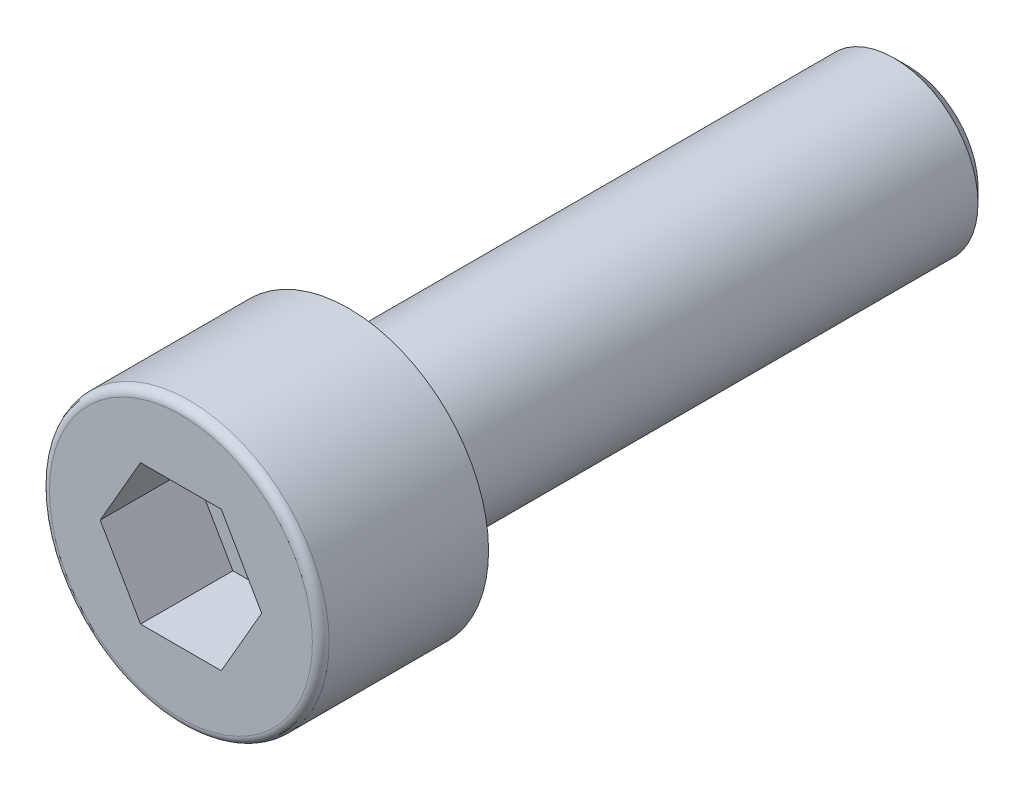
ISO-10303-21;
HEADER;
FILE_DESCRIPTION(('STEP AP214'),'2;1');
FILE_NAME('part.step','',(''),(''),'','','');
FILE_SCHEMA(('AUTOMOTIVE_DESIGN { 1 0 10303 214 1 1 1 1 }'));
ENDSEC;
DATA;
#1=APPLICATION_CONTEXT('core data for automotive mechanical design processes');
#2=APPLICATION_PROTOCOL_DEFINITION('international standard','automotive_design',2000,#1);
#3=PRODUCT_CONTEXT('',#1,'mechanical');
#4=PRODUCT('Part','Part','',(#3));
#5=PRODUCT_RELATED_PRODUCT_CATEGORY('part','',(#4));
#6=PRODUCT_DEFINITION_FORMATION('','',#4);
#7=PRODUCT_DEFINITION_CONTEXT('part definition',#1,'design');
#8=PRODUCT_DEFINITION('design','',#6,#7);
#9=PRODUCT_DEFINITION_SHAPE('','',#8);
#10=(LENGTH_UNIT() NAMED_UNIT(*) SI_UNIT(.MILLI.,.METRE.));
#11=(NAMED_UNIT(*) PLANE_ANGLE_UNIT() SI_UNIT($,.RADIAN.));
#12=(NAMED_UNIT(*) SI_UNIT($,.STERADIAN.) SOLID_ANGLE_UNIT());
#13=UNCERTAINTY_MEASURE_WITH_UNIT(LENGTH_MEASURE(1.E-05),#10,'distance_accuracy_value','');
#14=(GEOMETRIC_REPRESENTATION_CONTEXT(3) GLOBAL_UNCERTAINTY_ASSIGNED_CONTEXT((#13)) GLOBAL_UNIT_ASSIGNED_CONTEXT((#10,
#11,#12)) REPRESENTATION_CONTEXT('',''));
#15=CARTESIAN_POINT('',(0.,0.,0.));
#16=DIRECTION('',(0.,0.,1.));
#17=DIRECTION('',(1.,0.,0.));
#18=AXIS2_PLACEMENT_3D('',#15,#16,#17);
#19=CARTESIAN_POINT('',(0.,0.,-20.));
#20=DIRECTION('',(0.,0.,-1.));
#21=DIRECTION('',(-1.,0.,0.));
#22=AXIS2_PLACEMENT_3D('',#19,#20,#21);
#23=PLANE('',#22);
#24=CARTESIAN_POINT('',(0.,0.,-20.));
#25=DIRECTION('',(0.,0.,-1.));
#26=DIRECTION('',(-1.,0.,0.));
#27=AXIS2_PLACEMENT_3D('',#24,#25,#26);
#28=CIRCLE('',#27,2.5);
#29=CARTESIAN_POINT('',(-2.5,0.,-20.));
#30=VERTEX_POINT('',#29);
#31=EDGE_CURVE('E11',#30,#30,#28,.T.);
#32=ORIENTED_EDGE('',*,*,#31,.T.);
#33=EDGE_LOOP('',(#32));
#34=FACE_BOUND('',#33,.T.);
#35=ADVANCED_FACE('F53',(#34),#23,.T.);
#36=CARTESIAN_POINT('',(0.,0.,6.));
#37=DIRECTION('',(0.,0.,1.));
#38=DIRECTION('',(1.,0.,0.));
#39=AXIS2_PLACEMENT_3D('',#36,#37,#38);
#40=CYLINDRICAL_SURFACE('',#39,2.99999999999999);
#41=CARTESIAN_POINT('',(0.,0.,-19.5));
#42=DIRECTION('',(0.,0.,-1.));
#43=DIRECTION('',(-1.,0.,0.));
#44=AXIS2_PLACEMENT_3D('',#41,#42,#43);
#45=CIRCLE('',#44,2.99999999999999);
#46=CARTESIAN_POINT('',(-2.99999999999999,0.,-19.5));
#47=VERTEX_POINT('',#46);
#48=EDGE_CURVE('E62',#47,#47,#45,.F.);
#49=ORIENTED_EDGE('',*,*,#48,.T.);
#50=EDGE_LOOP('',(#49));
#51=FACE_BOUND('',#50,.T.);
#52=CARTESIAN_POINT('',(0.,0.,0.));
#53=DIRECTION('',(0.,0.,1.));
#54=DIRECTION('',(1.,0.,0.));
#55=AXIS2_PLACEMENT_3D('',#52,#53,#54);
#56=CIRCLE('',#55,2.99999999999999);
#57=CARTESIAN_POINT('',(2.99999999999999,0.,0.));
#58=VERTEX_POINT('',#57);
#59=EDGE_CURVE('E190',#58,#58,#56,.T.);
#60=ORIENTED_EDGE('',*,*,#59,.F.);
#61=EDGE_LOOP('',(#60));
#62=FACE_BOUND('',#61,.T.);
#63=ADVANCED_FACE('F198',(#51,#62),#40,.T.);
#64=CARTESIAN_POINT('',(2.99999999999999,0.,0.));
#65=DIRECTION('',(0.,0.,-1.));
#66=DIRECTION('',(-1.,0.,0.));
#67=AXIS2_PLACEMENT_3D('',#64,#65,#66);
#68=PLANE('',#67);
#69=ORIENTED_EDGE('',*,*,#59,.T.);
#70=EDGE_LOOP('',(#69));
#71=FACE_BOUND('',#70,.T.);
#72=CARTESIAN_POINT('',(0.,0.,0.));
#73=DIRECTION('',(0.,0.,1.));
#74=DIRECTION('',(1.,0.,0.));
#75=AXIS2_PLACEMENT_3D('',#72,#73,#74);
#76=CIRCLE('',#75,5.);
#77=CARTESIAN_POINT('',(5.,0.,0.));
#78=VERTEX_POINT('',#77);
#79=EDGE_CURVE('E186',#78,#78,#76,.T.);
#80=ORIENTED_EDGE('',*,*,#79,.F.);
#81=EDGE_LOOP('',(#80));
#82=FACE_BOUND('',#81,.T.);
#83=ADVANCED_FACE('F216',(#71,#82),#68,.T.);
#84=CARTESIAN_POINT('',(0.,0.,6.));
#85=DIRECTION('',(0.,0.,1.));
#86=DIRECTION('',(1.,0.,0.));
#87=AXIS2_PLACEMENT_3D('',#84,#85,#86);
#88=CYLINDRICAL_SURFACE('',#87,5.);
#89=ORIENTED_EDGE('',*,*,#79,.T.);
#90=EDGE_LOOP('',(#89));
#91=FACE_BOUND('',#90,.T.);
#92=CARTESIAN_POINT('',(0.,0.,5.7));
#93=DIRECTION('',(0.,0.,1.));
#94=DIRECTION('',(1.,0.,0.));
#95=AXIS2_PLACEMENT_3D('',#92,#93,#94);
#96=CIRCLE('',#95,5.);
#97=CARTESIAN_POINT('',(5.,0.,5.7));
#98=VERTEX_POINT('',#97);
#99=EDGE_CURVE('E182',#98,#98,#96,.T.);
#100=ORIENTED_EDGE('',*,*,#99,.F.);
#101=EDGE_LOOP('',(#100));
#102=FACE_BOUND('',#101,.T.);
#103=ADVANCED_FACE('F221',(#91,#102),#88,.T.);
#104=CARTESIAN_POINT('',(0.,0.,5.7));
#105=DIRECTION('',(0.,0.,1.));
#106=DIRECTION('',(1.,0.,0.));
#107=AXIS2_PLACEMENT_3D('',#104,#105,#106);
#108=TOROIDAL_SURFACE('',#107,4.7,0.299999999999999);
#109=ORIENTED_EDGE('',*,*,#99,.T.);
#110=EDGE_LOOP('',(#109));
#111=FACE_BOUND('',#110,.T.);
#112=CARTESIAN_POINT('',(0.,0.,6.));
#113=DIRECTION('',(0.,0.,1.));
#114=DIRECTION('',(1.,0.,0.));
#115=AXIS2_PLACEMENT_3D('',#112,#113,#114);
#116=CIRCLE('',#115,4.7);
#117=CARTESIAN_POINT('',(4.7,0.,6.));
#118=VERTEX_POINT('',#117);
#119=EDGE_CURVE('E169',#118,#118,#116,.T.);
#120=ORIENTED_EDGE('',*,*,#119,.F.);
#121=EDGE_LOOP('',(#120));
#122=FACE_BOUND('',#121,.T.);
#123=ADVANCED_FACE('F225',(#111,#122),#108,.T.);
#124=CARTESIAN_POINT('',(4.7,0.,6.));
#125=DIRECTION('',(0.,0.,1.));
#126=DIRECTION('',(1.,0.,0.));
#127=AXIS2_PLACEMENT_3D('',#124,#125,#126);
#128=PLANE('',#127);
#129=DIRECTION('',(0.499999999999999,0.866025403784439,0.));
#130=VECTOR('',#129,1.);
#131=CARTESIAN_POINT('',(1.44337567297406,-2.5,6.));
#132=LINE('',#131,#130);
#133=CARTESIAN_POINT('',(1.44337567297406,-2.5,6.));
#134=VERTEX_POINT('',#133);
#135=CARTESIAN_POINT('',(2.88675134594813,0.,6.));
#136=VERTEX_POINT('',#135);
#137=EDGE_CURVE('E69',#134,#136,#132,.T.);
#138=ORIENTED_EDGE('',*,*,#137,.F.);
#139=DIRECTION('',(1.,0.,0.));
#140=VECTOR('',#139,1.);
#141=CARTESIAN_POINT('',(-1.44337567297406,-2.5,6.));
#142=LINE('',#141,#140);
#143=CARTESIAN_POINT('',(-1.44337567297406,-2.5,6.));
#144=VERTEX_POINT('',#143);
#145=EDGE_CURVE('E163',#144,#134,#142,.T.);
#146=ORIENTED_EDGE('',*,*,#145,.F.);
#147=DIRECTION('',(0.5,-0.866025403784438,0.));
#148=VECTOR('',#147,1.);
#149=CARTESIAN_POINT('',(-2.88675134594813,0.,6.));
#150=LINE('',#149,#148);
#151=CARTESIAN_POINT('',(-2.88675134594813,0.,6.));
#152=VERTEX_POINT('',#151);
#153=EDGE_CURVE('E160',#152,#144,#150,.T.);
#154=ORIENTED_EDGE('',*,*,#153,.F.);
#155=DIRECTION('',(-0.499999999999999,-0.866025403784439,0.));
#156=VECTOR('',#155,1.);
#157=CARTESIAN_POINT('',(-1.44337567297406,2.5,6.));
#158=LINE('',#157,#156);
#159=CARTESIAN_POINT('',(-1.44337567297406,2.5,6.));
#160=VERTEX_POINT('',#159);
#161=EDGE_CURVE('E117',#160,#152,#158,.T.);
#162=ORIENTED_EDGE('',*,*,#161,.F.);
#163=DIRECTION('',(-1.,0.,0.));
#164=VECTOR('',#163,1.);
#165=CARTESIAN_POINT('',(1.44337567297406,2.5,6.));
#166=LINE('',#165,#164);
#167=CARTESIAN_POINT('',(1.44337567297406,2.5,6.));
#168=VERTEX_POINT('',#167);
#169=EDGE_CURVE('E154',#168,#160,#166,.T.);
#170=ORIENTED_EDGE('',*,*,#169,.F.);
#171=DIRECTION('',(-0.5,0.866025403784438,0.));
#172=VECTOR('',#171,1.);
#173=CARTESIAN_POINT('',(2.88675134594813,0.,6.));
#174=LINE('',#173,#172);
#175=EDGE_CURVE('E150',#136,#168,#174,.T.);
#176=ORIENTED_EDGE('',*,*,#175,.F.);
#177=EDGE_LOOP('',(#138,#146,#154,#162,#170,#176));
#178=FACE_BOUND('',#177,.T.);
#179=ORIENTED_EDGE('',*,*,#119,.T.);
#180=EDGE_LOOP('',(#179));
#181=FACE_BOUND('',#180,.T.);
#182=ADVANCED_FACE('F229',(#178,#181),#128,.T.);
#183=CARTESIAN_POINT('',(1.44337567297406,-2.5,2.7));
#184=DIRECTION('',(0.866025403784439,-0.499999999999999,0.));
#185=DIRECTION('',(0.5,0.866025403784439,0.));
#186=AXIS2_PLACEMENT_3D('',#183,#184,#185);
#187=PLANE('',#186);
#188=ORIENTED_EDGE('',*,*,#137,.T.);
#189=DIRECTION('',(0.,0.,1.));
#190=VECTOR('',#189,1.);
#191=CARTESIAN_POINT('',(2.88675134594813,0.,2.7));
#192=LINE('',#191,#190);
#193=CARTESIAN_POINT('',(2.88675134594813,0.,2.7));
#194=VERTEX_POINT('',#193);
#195=EDGE_CURVE('E99',#194,#136,#192,.T.);
#196=ORIENTED_EDGE('',*,*,#195,.F.);
#197=DIRECTION('',(0.499999999999999,0.866025403784439,0.));
#198=VECTOR('',#197,1.);
#199=CARTESIAN_POINT('',(1.44337567297406,-2.5,2.7));
#200=LINE('',#199,#198);
#201=CARTESIAN_POINT('',(1.44337567297406,-2.5,2.7));
#202=VERTEX_POINT('',#201);
#203=EDGE_CURVE('E166',#202,#194,#200,.T.);
#204=ORIENTED_EDGE('',*,*,#203,.F.);
#205=DIRECTION('',(0.,0.,1.));
#206=VECTOR('',#205,1.);
#207=CARTESIAN_POINT('',(1.44337567297406,-2.5,2.7));
#208=LINE('',#207,#206);
#209=EDGE_CURVE('E77',#202,#134,#208,.T.);
#210=ORIENTED_EDGE('',*,*,#209,.T.);
#211=EDGE_LOOP('',(#188,#196,#204,#210));
#212=FACE_BOUND('',#211,.T.);
#213=ADVANCED_FACE('F233',(#212),#187,.F.);
#214=CARTESIAN_POINT('',(-1.44337567297406,-2.5,2.7));
#215=DIRECTION('',(0.,-1.,0.));
#216=DIRECTION('',(1.,0.,0.));
#217=AXIS2_PLACEMENT_3D('',#214,#215,#216);
#218=PLANE('',#217);
#219=ORIENTED_EDGE('',*,*,#145,.T.);
#220=ORIENTED_EDGE('',*,*,#209,.F.);
#221=DIRECTION('',(1.,0.,0.));
#222=VECTOR('',#221,1.);
#223=CARTESIAN_POINT('',(-1.44337567297406,-2.5,2.7));
#224=LINE('',#223,#222);
#225=CARTESIAN_POINT('',(-1.44337567297406,-2.5,2.7));
#226=VERTEX_POINT('',#225);
#227=EDGE_CURVE('E131',#226,#202,#224,.T.);
#228=ORIENTED_EDGE('',*,*,#227,.F.);
#229=DIRECTION('',(0.,0.,1.));
#230=VECTOR('',#229,1.);
#231=CARTESIAN_POINT('',(-1.44337567297406,-2.5,2.7));
#232=LINE('',#231,#230);
#233=EDGE_CURVE('E122',#226,#144,#232,.T.);
#234=ORIENTED_EDGE('',*,*,#233,.T.);
#235=EDGE_LOOP('',(#219,#220,#228,#234));
#236=FACE_BOUND('',#235,.T.);
#237=ADVANCED_FACE('F237',(#236),#218,.F.);
#238=CARTESIAN_POINT('',(-2.88675134594813,0.,2.7));
#239=DIRECTION('',(-0.866025403784438,-0.5,0.));
#240=DIRECTION('',(0.5,-0.866025403784439,0.));
#241=AXIS2_PLACEMENT_3D('',#238,#239,#240);
#242=PLANE('',#241);
#243=ORIENTED_EDGE('',*,*,#153,.T.);
#244=ORIENTED_EDGE('',*,*,#233,.F.);
#245=DIRECTION('',(0.5,-0.866025403784438,0.));
#246=VECTOR('',#245,1.);
#247=CARTESIAN_POINT('',(-2.88675134594813,0.,2.7));
#248=LINE('',#247,#246);
#249=CARTESIAN_POINT('',(-2.88675134594813,0.,2.7));
#250=VERTEX_POINT('',#249);
#251=EDGE_CURVE('E126',#250,#226,#248,.T.);
#252=ORIENTED_EDGE('',*,*,#251,.F.);
#253=DIRECTION('',(0.,0.,1.));
#254=VECTOR('',#253,1.);
#255=CARTESIAN_POINT('',(-2.88675134594813,0.,2.7));
#256=LINE('',#255,#254);
#257=EDGE_CURVE('E110',#250,#152,#256,.T.);
#258=ORIENTED_EDGE('',*,*,#257,.T.);
#259=EDGE_LOOP('',(#243,#244,#252,#258));
#260=FACE_BOUND('',#259,.T.);
#261=ADVANCED_FACE('F127',(#260),#242,.F.);
#262=CARTESIAN_POINT('',(-1.44337567297406,2.5,2.7));
#263=DIRECTION('',(-0.866025403784439,0.499999999999999,0.));
#264=DIRECTION('',(-0.499999999999999,-0.866025403784439,0.));
#265=AXIS2_PLACEMENT_3D('',#262,#263,#264);
#266=PLANE('',#265);
#267=ORIENTED_EDGE('',*,*,#161,.T.);
#268=ORIENTED_EDGE('',*,*,#257,.F.);
#269=DIRECTION('',(-0.499999999999999,-0.866025403784439,0.));
#270=VECTOR('',#269,1.);
#271=CARTESIAN_POINT('',(-1.44337567297406,2.5,2.7));
#272=LINE('',#271,#270);
#273=CARTESIAN_POINT('',(-1.44337567297406,2.5,2.7));
#274=VERTEX_POINT('',#273);
#275=EDGE_CURVE('E114',#274,#250,#272,.T.);
#276=ORIENTED_EDGE('',*,*,#275,.F.);
#277=DIRECTION('',(0.,0.,1.));
#278=VECTOR('',#277,1.);
#279=CARTESIAN_POINT('',(-1.44337567297406,2.5,2.7));
#280=LINE('',#279,#278);
#281=EDGE_CURVE('E123',#274,#160,#280,.T.);
#282=ORIENTED_EDGE('',*,*,#281,.T.);
#283=EDGE_LOOP('',(#267,#268,#276,#282));
#284=FACE_BOUND('',#283,.T.);
#285=ADVANCED_FACE('F112',(#284),#266,.F.);
#286=CARTESIAN_POINT('',(1.44337567297406,2.5,2.7));
#287=DIRECTION('',(0.,1.,0.));
#288=DIRECTION('',(0.,0.,1.));
#289=AXIS2_PLACEMENT_3D('',#286,#287,#288);
#290=PLANE('',#289);
#291=ORIENTED_EDGE('',*,*,#169,.T.);
#292=ORIENTED_EDGE('',*,*,#281,.F.);
#293=DIRECTION('',(-1.,0.,0.));
#294=VECTOR('',#293,1.);
#295=CARTESIAN_POINT('',(1.44337567297406,2.5,2.7));
#296=LINE('',#295,#294);
#297=CARTESIAN_POINT('',(1.44337567297406,2.5,2.7));
#298=VERTEX_POINT('',#297);
#299=EDGE_CURVE('E137',#298,#274,#296,.T.);
#300=ORIENTED_EDGE('',*,*,#299,.F.);
#301=DIRECTION('',(0.,0.,1.));
#302=VECTOR('',#301,1.);
#303=CARTESIAN_POINT('',(1.44337567297406,2.5,2.7));
#304=LINE('',#303,#302);
#305=EDGE_CURVE('E174',#298,#168,#304,.T.);
#306=ORIENTED_EDGE('',*,*,#305,.T.);
#307=EDGE_LOOP('',(#291,#292,#300,#306));
#308=FACE_BOUND('',#307,.T.);
#309=ADVANCED_FACE('F240',(#308),#290,.F.);
#310=CARTESIAN_POINT('',(2.88675134594813,0.,2.7));
#311=DIRECTION('',(0.866025403784438,0.5,0.));
#312=DIRECTION('',(-0.5,0.866025403784439,0.));
#313=AXIS2_PLACEMENT_3D('',#310,#311,#312);
#314=PLANE('',#313);
#315=ORIENTED_EDGE('',*,*,#175,.T.);
#316=ORIENTED_EDGE('',*,*,#305,.F.);
#317=DIRECTION('',(-0.5,0.866025403784438,0.));
#318=VECTOR('',#317,1.);
#319=CARTESIAN_POINT('',(2.88675134594813,0.,2.7));
#320=LINE('',#319,#318);
#321=EDGE_CURVE('E142',#194,#298,#320,.T.);
#322=ORIENTED_EDGE('',*,*,#321,.F.);
#323=ORIENTED_EDGE('',*,*,#195,.T.);
#324=EDGE_LOOP('',(#315,#316,#322,#323));
#325=FACE_BOUND('',#324,.T.);
#326=ADVANCED_FACE('F207',(#325),#314,.F.);
#327=CARTESIAN_POINT('',(2.88675134594813,0.,2.7));
#328=DIRECTION('',(0.,0.,1.));
#329=DIRECTION('',(1.,0.,0.));
#330=AXIS2_PLACEMENT_3D('',#327,#328,#329);
#331=PLANE('',#330);
#332=ORIENTED_EDGE('',*,*,#203,.T.);
#333=ORIENTED_EDGE('',*,*,#321,.T.);
#334=ORIENTED_EDGE('',*,*,#299,.T.);
#335=ORIENTED_EDGE('',*,*,#275,.T.);
#336=ORIENTED_EDGE('',*,*,#251,.T.);
#337=ORIENTED_EDGE('',*,*,#227,.T.);
#338=EDGE_LOOP('',(#332,#333,#334,#335,#336,#337));
#339=FACE_BOUND('',#338,.T.);
#340=ADVANCED_FACE('F134',(#339),#331,.T.);
#341=CARTESIAN_POINT('',(0.,0.,-19.5));
#342=DIRECTION('',(0.,0.,1.));
#343=DIRECTION('',(1.,0.,0.));
#344=AXIS2_PLACEMENT_3D('',#341,#342,#343);
#345=CONICAL_SURFACE('',#344,2.99999999999999,0.785398163397455);
#346=ORIENTED_EDGE('',*,*,#31,.F.);
#347=EDGE_LOOP('',(#346));
#348=FACE_BOUND('',#347,.T.);
#349=ORIENTED_EDGE('',*,*,#48,.F.);
#350=EDGE_LOOP('',(#349));
#351=FACE_BOUND('',#350,.T.);
#352=ADVANCED_FACE('F55',(#348,#351),#345,.T.);
#353=CLOSED_SHELL('',(#35,#63,#83,#103,#123,#182,#213,#237,#261,#285,#309,#326,#340,#352));
#354=MANIFOLD_SOLID_BREP('B2',#353);
#355=ADVANCED_BREP_SHAPE_REPRESENTATION('',(#18,#354),#14);
#356=SHAPE_DEFINITION_REPRESENTATION(#9,#355);
ENDSEC;
END-ISO-10303-21;
